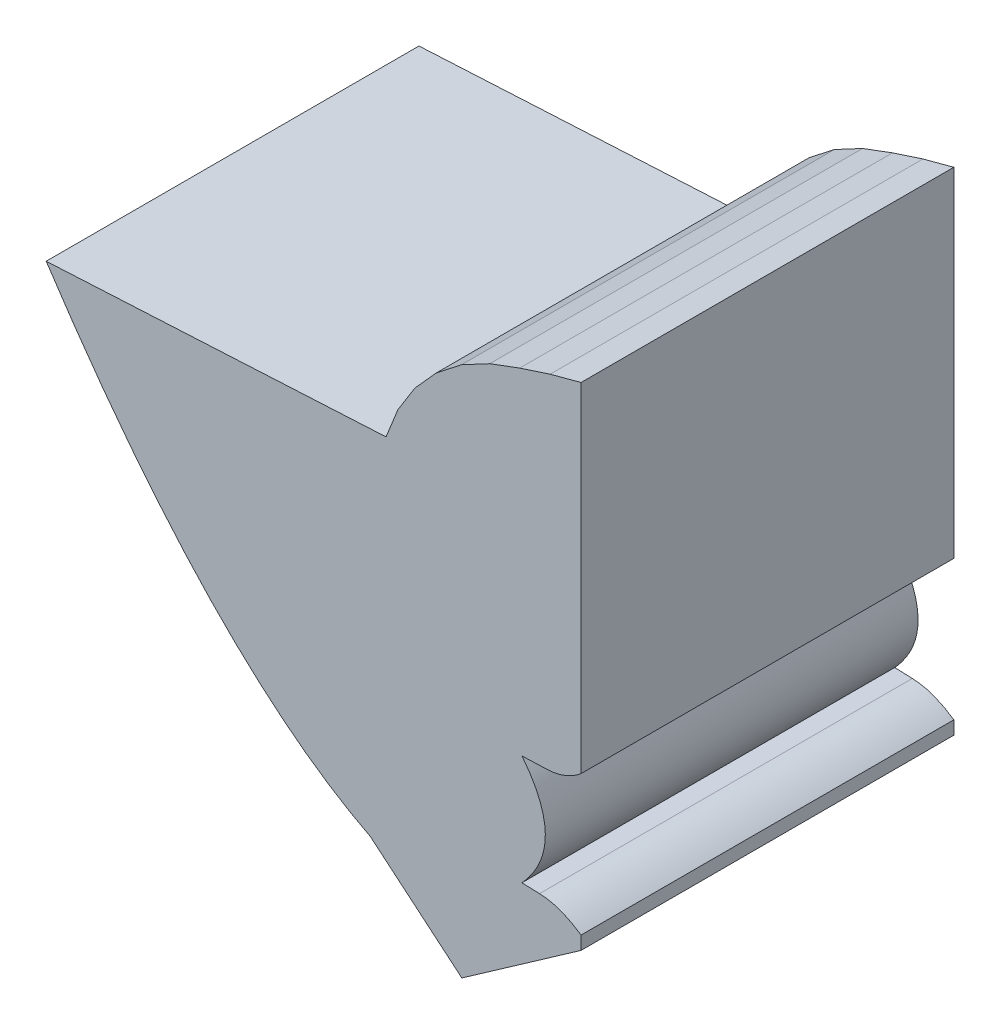
ISO-10303-21;
HEADER;
FILE_DESCRIPTION(('STEP AP214'),'2;1');
FILE_NAME('part.step','',(''),(''),'','','');
FILE_SCHEMA(('AUTOMOTIVE_DESIGN { 1 0 10303 214 1 1 1 1 }'));
ENDSEC;
DATA;
#1=APPLICATION_CONTEXT('core data for automotive mechanical design processes');
#2=APPLICATION_PROTOCOL_DEFINITION('international standard','automotive_design',2000,#1);
#3=PRODUCT_CONTEXT('',#1,'mechanical');
#4=PRODUCT('Part','Part','',(#3));
#5=PRODUCT_RELATED_PRODUCT_CATEGORY('part','',(#4));
#6=PRODUCT_DEFINITION_FORMATION('','',#4);
#7=PRODUCT_DEFINITION_CONTEXT('part definition',#1,'design');
#8=PRODUCT_DEFINITION('design','',#6,#7);
#9=PRODUCT_DEFINITION_SHAPE('','',#8);
#10=(LENGTH_UNIT() NAMED_UNIT(*) SI_UNIT(.MILLI.,.METRE.));
#11=(NAMED_UNIT(*) PLANE_ANGLE_UNIT() SI_UNIT($,.RADIAN.));
#12=(NAMED_UNIT(*) SI_UNIT($,.STERADIAN.) SOLID_ANGLE_UNIT());
#13=UNCERTAINTY_MEASURE_WITH_UNIT(LENGTH_MEASURE(1.E-05),#10,'distance_accuracy_value','');
#14=(GEOMETRIC_REPRESENTATION_CONTEXT(3) GLOBAL_UNCERTAINTY_ASSIGNED_CONTEXT((#13)) GLOBAL_UNIT_ASSIGNED_CONTEXT((#10,
#11,#12)) REPRESENTATION_CONTEXT('',''));
#15=CARTESIAN_POINT('',(0.,0.,0.));
#16=DIRECTION('',(0.,0.,1.));
#17=DIRECTION('',(1.,0.,0.));
#18=AXIS2_PLACEMENT_3D('',#15,#16,#17);
#19=CARTESIAN_POINT('',(-996004.99942647,89338.2959789018,30.7968303069805));
#20=CARTESIAN_POINT('',(996193.448091746,-87155.7427476542,30.7968303069805));
#21=CARTESIAN_POINT('',(-996386.896757022,84973.1895164066,30.7968303069805));
#22=B_SPLINE_CURVE_WITH_KNOTS('',2,(#19,#20,#21),.UNSPECIFIED.,.F.,.F.,(3,3),(0.,1.),.UNSPECIFIED.);
#23=DIRECTION('',(0.,0.,-1.));
#24=VECTOR('',#23,1.);
#25=SURFACE_OF_LINEAR_EXTRUSION('',#22,#24);
#26=CARTESIAN_POINT('',(-996004.99942647,89338.2959789018,6.9937));
#27=CARTESIAN_POINT('',(996193.448091746,-87155.7427476542,6.9937));
#28=CARTESIAN_POINT('',(-996386.896757022,84973.1895164066,6.9937));
#29=B_SPLINE_CURVE_WITH_KNOTS('',2,(#26,#27,#28),.UNSPECIFIED.,.F.,.F.,(3,3),(0.,1.),.UNSPECIFIED.);
#30=CARTESIAN_POINT('',(-2.11351559756429,2.34471545593529,6.9937));
#31=VERTEX_POINT('',#30);
#32=CARTESIAN_POINT('',(-2.11897326832718,-1.77801919490998,6.9937));
#33=VERTEX_POINT('',#32);
#34=EDGE_CURVE('E300',#31,#33,#29,.T.);
#35=ORIENTED_EDGE('',*,*,#34,.T.);
#36=DIRECTION('',(0.,0.,-1.));
#37=VECTOR('',#36,1.);
#38=CARTESIAN_POINT('',(-2.11897326731891,-1.77801919494525,0.));
#39=LINE('',#38,#37);
#40=CARTESIAN_POINT('',(-2.11897326832642,-1.77801919491,-6.9937));
#41=VERTEX_POINT('',#40);
#42=EDGE_CURVE('E224',#33,#41,#39,.T.);
#43=ORIENTED_EDGE('',*,*,#42,.T.);
#44=CARTESIAN_POINT('',(-996004.99942647,89338.2959789018,-6.9937));
#45=CARTESIAN_POINT('',(996193.448091746,-87155.7427476542,-6.9937));
#46=CARTESIAN_POINT('',(-996386.896757022,84973.1895164066,-6.9937));
#47=B_SPLINE_CURVE_WITH_KNOTS('',2,(#44,#45,#46),.UNSPECIFIED.,.F.,.F.,(3,3),(0.,1.),.UNSPECIFIED.);
#48=CARTESIAN_POINT('',(-2.11351559802885,2.3447154697661,-6.9937));
#49=VERTEX_POINT('',#48);
#50=EDGE_CURVE('E193',#41,#49,#47,.F.);
#51=ORIENTED_EDGE('',*,*,#50,.T.);
#52=DIRECTION('',(0.,0.,-1.));
#53=VECTOR('',#52,1.);
#54=CARTESIAN_POINT('',(-2.11351560820955,2.34471546941639,0.));
#55=LINE('',#54,#53);
#56=EDGE_CURVE('E63',#49,#31,#55,.F.);
#57=ORIENTED_EDGE('',*,*,#56,.T.);
#58=EDGE_LOOP('',(#35,#43,#51,#57));
#59=FACE_BOUND('',#58,.T.);
#60=ADVANCED_FACE('F60',(#59),#25,.T.);
#61=CARTESIAN_POINT('',(-82931.2998220372,996560.090302793,30.7968303069805));
#62=CARTESIAN_POINT('',(87153.689514863,-996199.076380996,30.7968303069805));
#63=CARTESIAN_POINT('',(-91384.2921388703,995820.549302198,30.7968303069805));
#64=B_SPLINE_CURVE_WITH_KNOTS('',2,(#61,#62,#63),.UNSPECIFIED.,.F.,.F.,(3,3),(0.,1.),.UNSPECIFIED.);
#65=DIRECTION('',(0.,0.,-1.));
#66=VECTOR('',#65,1.);
#67=SURFACE_OF_LINEAR_EXTRUSION('',#64,#66);
#68=CARTESIAN_POINT('',(-82931.2998220372,996560.090302793,-6.9937));
#69=CARTESIAN_POINT('',(87153.689514863,-996199.076380996,-6.9937));
#70=CARTESIAN_POINT('',(-91384.2921388703,995820.549302198,-6.9937));
#71=B_SPLINE_CURVE_WITH_KNOTS('',2,(#68,#69,#70),.UNSPECIFIED.,.F.,.F.,(3,3),(0.,1.),.UNSPECIFIED.);
#72=CARTESIAN_POINT('',(-19.9693590135837,9.49376503209609,-6.9937));
#73=VERTEX_POINT('',#72);
#74=CARTESIAN_POINT('',(-7.80629587003376,-3.11931996622238,-6.9937));
#75=VERTEX_POINT('',#74);
#76=EDGE_CURVE('E287',#73,#75,#71,.F.);
#77=ORIENTED_EDGE('',*,*,#76,.T.);
#78=DIRECTION('',(0.,0.,-1.));
#79=VECTOR('',#78,1.);
#80=CARTESIAN_POINT('',(-7.80629593446314,-3.11931991215808,0.));
#81=LINE('',#80,#79);
#82=CARTESIAN_POINT('',(-7.80629585753112,-3.11931995134695,6.9937));
#83=VERTEX_POINT('',#82);
#84=EDGE_CURVE('E13',#75,#83,#81,.F.);
#85=ORIENTED_EDGE('',*,*,#84,.T.);
#86=CARTESIAN_POINT('',(-82931.2998220372,996560.090302793,6.9937));
#87=CARTESIAN_POINT('',(87153.689514863,-996199.076380996,6.9937));
#88=CARTESIAN_POINT('',(-91384.2921388703,995820.549302198,6.9937));
#89=B_SPLINE_CURVE_WITH_KNOTS('',2,(#86,#87,#88),.UNSPECIFIED.,.F.,.F.,(3,3),(0.,1.),.UNSPECIFIED.);
#90=CARTESIAN_POINT('',(-19.9693590135837,9.49376503209609,6.9937));
#91=VERTEX_POINT('',#90);
#92=EDGE_CURVE('E296',#83,#91,#89,.T.);
#93=ORIENTED_EDGE('',*,*,#92,.T.);
#94=DIRECTION('',(0.,0.,1.));
#95=VECTOR('',#94,1.);
#96=CARTESIAN_POINT('',(-19.9693590135837,9.49376503209609,-6.9937));
#97=LINE('',#96,#95);
#98=EDGE_CURVE('E284',#73,#91,#97,.T.);
#99=ORIENTED_EDGE('',*,*,#98,.F.);
#100=EDGE_LOOP('',(#77,#85,#93,#99));
#101=FACE_BOUND('',#100,.T.);
#102=ADVANCED_FACE('F328',(#101),#67,.T.);
#103=CARTESIAN_POINT('',(0.,0.,6.9937));
#104=DIRECTION('',(0.,0.,1.));
#105=DIRECTION('',(1.,0.,0.));
#106=AXIS2_PLACEMENT_3D('',#103,#104,#105);
#107=PLANE('',#106);
#108=ORIENTED_EDGE('',*,*,#92,.F.);
#109=DIRECTION('',(0.766044443118984,-0.642787609686532,0.));
#110=VECTOR('',#109,1.);
#111=CARTESIAN_POINT('',(-9.72117641002242,-1.51254441136937,6.9937));
#112=LINE('',#111,#110);
#113=CARTESIAN_POINT('',(-4.37323509066481,-6.,6.9937));
#114=VERTEX_POINT('',#113);
#115=EDGE_CURVE('E75',#83,#114,#112,.T.);
#116=ORIENTED_EDGE('',*,*,#115,.T.);
#117=DIRECTION('',(0.819152044288989,0.57357643635105,0.));
#118=VECTOR('',#117,1.);
#119=CARTESIAN_POINT('',(0.100000000004221,-2.86780706932932,6.9937));
#120=LINE('',#119,#118);
#121=CARTESIAN_POINT('',(0.100000000004221,-2.86780706932932,6.9937));
#122=VERTEX_POINT('',#121);
#123=EDGE_CURVE('E225',#114,#122,#120,.T.);
#124=ORIENTED_EDGE('',*,*,#123,.T.);
#125=DIRECTION('',(8.61615466474804E-13,1.,0.));
#126=VECTOR('',#125,1.);
#127=CARTESIAN_POINT('',(0.100000000004652,-2.36780706932965,6.9937));
#128=LINE('',#127,#126);
#129=CARTESIAN_POINT('',(0.100000000004652,-2.36780706932965,6.9937));
#130=VERTEX_POINT('',#129);
#131=EDGE_CURVE('E235',#122,#130,#128,.T.);
#132=ORIENTED_EDGE('',*,*,#131,.T.);
#133=CARTESIAN_POINT('',(-15263.34989045,-999887.731463145,6.9937));
#134=CARTESIAN_POINT('',(17450.9064372768,999845.895156391,6.9937));
#135=CARTESIAN_POINT('',(-19644.4629841036,-999811.258849637,6.9937));
#136=B_SPLINE_CURVE_WITH_KNOTS('',2,(#133,#134,#135),.UNSPECIFIED.,.F.,.F.,(3,3),(0.,1.),.UNSPECIFIED.);
#137=CARTESIAN_POINT('',(-1.45812060541251,-1.80109667841963,6.9937));
#138=VERTEX_POINT('',#137);
#139=EDGE_CURVE('E226',#130,#138,#136,.T.);
#140=ORIENTED_EDGE('',*,*,#139,.T.);
#141=DIRECTION('',(-0.999390827019096,0.034899496702504,0.));
#142=VECTOR('',#141,1.);
#143=CARTESIAN_POINT('',(-1.45812060541251,-1.80109667841963,6.9937));
#144=LINE('',#143,#142);
#145=EDGE_CURVE('E201',#138,#33,#144,.T.);
#146=ORIENTED_EDGE('',*,*,#145,.T.);
#147=ORIENTED_EDGE('',*,*,#34,.F.);
#148=DIRECTION('',(0.999390827019096,0.0348994967025048,0.));
#149=VECTOR('',#148,1.);
#150=CARTESIAN_POINT('',(-2.17733041778456,2.34248700715526,6.9937));
#151=LINE('',#150,#149);
#152=CARTESIAN_POINT('',(-1.19050164048462,2.37694782742692,6.9937));
#153=VERTEX_POINT('',#152);
#154=EDGE_CURVE('E79',#31,#153,#151,.T.);
#155=ORIENTED_EDGE('',*,*,#154,.T.);
#156=CARTESIAN_POINT('',(-343900.072311573,939011.080499257,6.9937));
#157=CARTESIAN_POINT('',(342019.599581338,-939690.120785908,6.9937));
#158=CARTESIAN_POINT('',(-340141.301828429,940379.16107256,6.9937));
#159=B_SPLINE_CURVE_WITH_KNOTS('',2,(#156,#157,#158),.UNSPECIFIED.,.F.,.F.,(3,3),(0.,1.),.UNSPECIFIED.);
#160=CARTESIAN_POINT('',(0.100000000004221,2.87767341815847,6.9937));
#161=VERTEX_POINT('',#160);
#162=EDGE_CURVE('E278',#153,#161,#159,.T.);
#163=ORIENTED_EDGE('',*,*,#162,.T.);
#164=DIRECTION('',(0.,1.,0.));
#165=VECTOR('',#164,1.);
#166=CARTESIAN_POINT('',(0.100000000004221,2.87767341815847,6.9937));
#167=LINE('',#166,#165);
#168=CARTESIAN_POINT('',(0.100000000004747,15.587903347272,6.9937));
#169=VERTEX_POINT('',#168);
#170=EDGE_CURVE('E548',#161,#169,#167,.T.);
#171=ORIENTED_EDGE('',*,*,#170,.T.);
#172=DIRECTION('',(-0.96592582628907,-0.258819045102515,0.));
#173=VECTOR('',#172,1.);
#174=CARTESIAN_POINT('',(-1.05911099154214,15.277320493149,6.9937));
#175=LINE('',#174,#173);
#176=CARTESIAN_POINT('',(-1.05911099154214,15.277320493149,6.9937));
#177=VERTEX_POINT('',#176);
#178=EDGE_CURVE('E536',#169,#177,#175,.T.);
#179=ORIENTED_EDGE('',*,*,#178,.T.);
#180=DIRECTION('',(-0.951056516295155,-0.309016994374943,0.));
#181=VECTOR('',#180,1.);
#182=CARTESIAN_POINT('',(-2.20037881109632,14.906500099899,6.9937));
#183=LINE('',#182,#181);
#184=CARTESIAN_POINT('',(-2.20037881109632,14.906500099899,6.9937));
#185=VERTEX_POINT('',#184);
#186=EDGE_CURVE('E545',#177,#185,#183,.T.);
#187=ORIENTED_EDGE('',*,*,#186,.T.);
#188=DIRECTION('',(-0.9366721892484,-0.350207381259461,0.));
#189=VECTOR('',#188,1.);
#190=CARTESIAN_POINT('',(-3.3243854381944,14.4862512423877,6.9937));
#191=LINE('',#190,#189);
#192=CARTESIAN_POINT('',(-3.3243854381944,14.4862512423877,6.9937));
#193=VERTEX_POINT('',#192);
#194=EDGE_CURVE('E618',#185,#193,#191,.T.);
#195=ORIENTED_EDGE('',*,*,#194,.T.);
#196=DIRECTION('',(-0.882947592859007,-0.46947156278574,0.));
#197=VECTOR('',#196,1.);
#198=CARTESIAN_POINT('',(-4.38392254962521,13.9228853670448,6.9937));
#199=LINE('',#198,#197);
#200=CARTESIAN_POINT('',(-4.38392254962521,13.9228853670448,6.9937));
#201=VERTEX_POINT('',#200);
#202=EDGE_CURVE('E611',#193,#201,#199,.T.);
#203=ORIENTED_EDGE('',*,*,#202,.T.);
#204=DIRECTION('',(-0.788010753606726,-0.615661475325654,0.));
#205=VECTOR('',#204,1.);
#206=CARTESIAN_POINT('',(-5.32953545395328,13.184091596654,6.9937));
#207=LINE('',#206,#205);
#208=CARTESIAN_POINT('',(-5.32953545395328,13.184091596654,6.9937));
#209=VERTEX_POINT('',#208);
#210=EDGE_CURVE('E610',#201,#209,#207,.T.);
#211=ORIENTED_EDGE('',*,*,#210,.T.);
#212=DIRECTION('',(-0.669130606358526,-0.743144825477694,0.));
#213=VECTOR('',#212,1.);
#214=CARTESIAN_POINT('',(-6.13249218158351,12.2923178060808,6.9937));
#215=LINE('',#214,#213);
#216=CARTESIAN_POINT('',(-6.13249218158351,12.2923178060808,6.9937));
#217=VERTEX_POINT('',#216);
#218=EDGE_CURVE('E607',#209,#217,#215,.T.);
#219=ORIENTED_EDGE('',*,*,#218,.T.);
#220=DIRECTION('',(-0.52991926423321,-0.848048096156423,0.));
#221=VECTOR('',#220,1.);
#222=CARTESIAN_POINT('',(-6.76839529866336,11.2746600906931,6.9937));
#223=LINE('',#222,#221);
#224=CARTESIAN_POINT('',(-6.76839529866336,11.2746600906931,6.9937));
#225=VERTEX_POINT('',#224);
#226=EDGE_CURVE('E601',#217,#225,#223,.T.);
#227=ORIENTED_EDGE('',*,*,#226,.T.);
#228=DIRECTION('',(-0.374606593415918,-0.927183854566785,0.));
#229=VECTOR('',#228,1.);
#230=CARTESIAN_POINT('',(-7.21792321076246,10.1620394652129,6.9937));
#231=LINE('',#230,#229);
#232=CARTESIAN_POINT('',(-7.21792321076246,10.1620394652129,6.9937));
#233=VERTEX_POINT('',#232);
#234=EDGE_CURVE('E604',#225,#233,#231,.T.);
#235=ORIENTED_EDGE('',*,*,#234,.T.);
#236=DIRECTION('',(-0.998629534754487,-0.0523359562445909,0.));
#237=VECTOR('',#236,1.);
#238=CARTESIAN_POINT('',(-19.9693590135837,9.49376503209609,6.9937));
#239=LINE('',#238,#237);
#240=EDGE_CURVE('E271',#233,#91,#239,.T.);
#241=ORIENTED_EDGE('',*,*,#240,.T.);
#242=EDGE_LOOP('',(#108,#116,#124,#132,#140,#146,#147,#155,#163,#171,#179,#187,#195,#203,#211,
#219,#227,#235,#241));
#243=FACE_BOUND('',#242,.T.);
#244=ADVANCED_FACE('F327',(#243),#107,.T.);
#245=CARTESIAN_POINT('',(0.,0.,-6.9937));
#246=DIRECTION('',(0.,0.,1.));
#247=DIRECTION('',(1.,0.,0.));
#248=AXIS2_PLACEMENT_3D('',#245,#246,#247);
#249=PLANE('',#248);
#250=ORIENTED_EDGE('',*,*,#50,.F.);
#251=DIRECTION('',(0.999390827019096,-0.034899496702504,0.));
#252=VECTOR('',#251,1.);
#253=CARTESIAN_POINT('',(-1.45812060541251,-1.80109667841963,-6.9937));
#254=LINE('',#253,#252);
#255=CARTESIAN_POINT('',(-1.45812060541251,-1.80109667841963,-6.9937));
#256=VERTEX_POINT('',#255);
#257=EDGE_CURVE('E189',#41,#256,#254,.T.);
#258=ORIENTED_EDGE('',*,*,#257,.T.);
#259=CARTESIAN_POINT('',(-15263.34989045,-999887.731463145,-6.9937));
#260=CARTESIAN_POINT('',(17450.9064372768,999845.895156391,-6.9937));
#261=CARTESIAN_POINT('',(-19644.4629841036,-999811.258849637,-6.9937));
#262=B_SPLINE_CURVE_WITH_KNOTS('',2,(#259,#260,#261),.UNSPECIFIED.,.F.,.F.,(3,3),(0.,1.),.UNSPECIFIED.);
#263=CARTESIAN_POINT('',(0.100000000004652,-2.36780706932965,-6.9937));
#264=VERTEX_POINT('',#263);
#265=EDGE_CURVE('E194',#256,#264,#262,.F.);
#266=ORIENTED_EDGE('',*,*,#265,.T.);
#267=DIRECTION('',(-8.61615466474804E-13,-1.,0.));
#268=VECTOR('',#267,1.);
#269=CARTESIAN_POINT('',(0.100000000004652,-2.36780706932965,-6.9937));
#270=LINE('',#269,#268);
#271=CARTESIAN_POINT('',(0.100000000004221,-2.86780706932932,-6.9937));
#272=VERTEX_POINT('',#271);
#273=EDGE_CURVE('E212',#264,#272,#270,.T.);
#274=ORIENTED_EDGE('',*,*,#273,.T.);
#275=DIRECTION('',(-0.819152044288989,-0.57357643635105,0.));
#276=VECTOR('',#275,1.);
#277=CARTESIAN_POINT('',(0.100000000004221,-2.86780706932932,-6.9937));
#278=LINE('',#277,#276);
#279=CARTESIAN_POINT('',(-4.37323509066481,-6.,-6.9937));
#280=VERTEX_POINT('',#279);
#281=EDGE_CURVE('E215',#272,#280,#278,.T.);
#282=ORIENTED_EDGE('',*,*,#281,.T.);
#283=DIRECTION('',(-0.766044443118984,0.642787609686532,0.));
#284=VECTOR('',#283,1.);
#285=CARTESIAN_POINT('',(-9.72117641002242,-1.51254441136937,-6.9937));
#286=LINE('',#285,#284);
#287=EDGE_CURVE('E357',#280,#75,#286,.T.);
#288=ORIENTED_EDGE('',*,*,#287,.T.);
#289=ORIENTED_EDGE('',*,*,#76,.F.);
#290=DIRECTION('',(-0.998629534754487,-0.0523359562445909,0.));
#291=VECTOR('',#290,1.);
#292=CARTESIAN_POINT('',(-19.9693590135837,9.49376503209609,-6.9937));
#293=LINE('',#292,#291);
#294=CARTESIAN_POINT('',(-7.21792321076246,10.1620394652129,-6.9937));
#295=VERTEX_POINT('',#294);
#296=EDGE_CURVE('E276',#295,#73,#293,.T.);
#297=ORIENTED_EDGE('',*,*,#296,.F.);
#298=DIRECTION('',(0.374606593415918,0.927183854566785,0.));
#299=VECTOR('',#298,1.);
#300=CARTESIAN_POINT('',(-7.21792321076246,10.1620394652129,-6.9937));
#301=LINE('',#300,#299);
#302=CARTESIAN_POINT('',(-6.76839529866336,11.2746600906931,-6.9937));
#303=VERTEX_POINT('',#302);
#304=EDGE_CURVE('E355',#295,#303,#301,.T.);
#305=ORIENTED_EDGE('',*,*,#304,.T.);
#306=DIRECTION('',(0.52991926423321,0.848048096156423,0.));
#307=VECTOR('',#306,1.);
#308=CARTESIAN_POINT('',(-6.76839529866336,11.2746600906931,-6.9937));
#309=LINE('',#308,#307);
#310=CARTESIAN_POINT('',(-6.13249218158351,12.2923178060808,-6.9937));
#311=VERTEX_POINT('',#310);
#312=EDGE_CURVE('E578',#303,#311,#309,.T.);
#313=ORIENTED_EDGE('',*,*,#312,.T.);
#314=DIRECTION('',(0.669130606358526,0.743144825477694,0.));
#315=VECTOR('',#314,1.);
#316=CARTESIAN_POINT('',(-6.13249218158351,12.2923178060808,-6.9937));
#317=LINE('',#316,#315);
#318=CARTESIAN_POINT('',(-5.32953545395328,13.184091596654,-6.9937));
#319=VERTEX_POINT('',#318);
#320=EDGE_CURVE('E635',#311,#319,#317,.T.);
#321=ORIENTED_EDGE('',*,*,#320,.T.);
#322=DIRECTION('',(0.788010753606726,0.615661475325654,0.));
#323=VECTOR('',#322,1.);
#324=CARTESIAN_POINT('',(-5.32953545395328,13.184091596654,-6.9937));
#325=LINE('',#324,#323);
#326=CARTESIAN_POINT('',(-4.38392254962521,13.9228853670448,-6.9937));
#327=VERTEX_POINT('',#326);
#328=EDGE_CURVE('E628',#319,#327,#325,.T.);
#329=ORIENTED_EDGE('',*,*,#328,.T.);
#330=DIRECTION('',(0.882947592859007,0.46947156278574,0.));
#331=VECTOR('',#330,1.);
#332=CARTESIAN_POINT('',(-4.38392254962521,13.9228853670448,-6.9937));
#333=LINE('',#332,#331);
#334=CARTESIAN_POINT('',(-3.3243854381944,14.4862512423877,-6.9937));
#335=VERTEX_POINT('',#334);
#336=EDGE_CURVE('E630',#327,#335,#333,.T.);
#337=ORIENTED_EDGE('',*,*,#336,.T.);
#338=DIRECTION('',(0.9366721892484,0.350207381259461,0.));
#339=VECTOR('',#338,1.);
#340=CARTESIAN_POINT('',(-3.3243854381944,14.4862512423877,-6.9937));
#341=LINE('',#340,#339);
#342=CARTESIAN_POINT('',(-2.20037881109632,14.906500099899,-6.9937));
#343=VERTEX_POINT('',#342);
#344=EDGE_CURVE('E621',#335,#343,#341,.T.);
#345=ORIENTED_EDGE('',*,*,#344,.T.);
#346=DIRECTION('',(0.951056516295155,0.309016994374943,0.));
#347=VECTOR('',#346,1.);
#348=CARTESIAN_POINT('',(-2.20037881109632,14.906500099899,-6.9937));
#349=LINE('',#348,#347);
#350=CARTESIAN_POINT('',(-1.05911099154214,15.277320493149,-6.9937));
#351=VERTEX_POINT('',#350);
#352=EDGE_CURVE('E595',#343,#351,#349,.T.);
#353=ORIENTED_EDGE('',*,*,#352,.T.);
#354=DIRECTION('',(0.96592582628907,0.258819045102515,0.));
#355=VECTOR('',#354,1.);
#356=CARTESIAN_POINT('',(-1.05911099154214,15.277320493149,-6.9937));
#357=LINE('',#356,#355);
#358=CARTESIAN_POINT('',(0.100000000004747,15.587903347272,-6.9937));
#359=VERTEX_POINT('',#358);
#360=EDGE_CURVE('E587',#351,#359,#357,.T.);
#361=ORIENTED_EDGE('',*,*,#360,.T.);
#362=DIRECTION('',(0.,-1.,0.));
#363=VECTOR('',#362,1.);
#364=CARTESIAN_POINT('',(0.100000000004221,2.87767341815847,-6.9937));
#365=LINE('',#364,#363);
#366=CARTESIAN_POINT('',(0.0999999999995449,2.8776734181557,-6.9937));
#367=VERTEX_POINT('',#366);
#368=EDGE_CURVE('E580',#359,#367,#365,.T.);
#369=ORIENTED_EDGE('',*,*,#368,.T.);
#370=CARTESIAN_POINT('',(-343900.072311573,939011.080499257,-6.9937));
#371=CARTESIAN_POINT('',(342019.599581338,-939690.120785908,-6.9937));
#372=CARTESIAN_POINT('',(-340141.301828429,940379.16107256,-6.9937));
#373=B_SPLINE_CURVE_WITH_KNOTS('',2,(#370,#371,#372),.UNSPECIFIED.,.F.,.F.,(3,3),(0.,1.),.UNSPECIFIED.);
#374=CARTESIAN_POINT('',(-1.19050164048462,2.37694782741517,-6.9937));
#375=VERTEX_POINT('',#374);
#376=EDGE_CURVE('E575',#367,#375,#373,.F.);
#377=ORIENTED_EDGE('',*,*,#376,.T.);
#378=DIRECTION('',(-0.999390827019096,-0.0348994967025048,0.));
#379=VECTOR('',#378,1.);
#380=CARTESIAN_POINT('',(-2.17733041778456,2.34248700715526,-6.9937));
#381=LINE('',#380,#379);
#382=EDGE_CURVE('E574',#375,#49,#381,.T.);
#383=ORIENTED_EDGE('',*,*,#382,.T.);
#384=EDGE_LOOP('',(#250,#258,#266,#274,#282,#288,#289,#297,#305,#313,#321,#329,#337,#345,#353,
#361,#369,#377,#383));
#385=FACE_BOUND('',#384,.T.);
#386=ADVANCED_FACE('F56',(#385),#249,.F.);
#387=CARTESIAN_POINT('',(-19.9693590135837,9.49376503209609,-6.9937));
#388=DIRECTION('',(-0.0523359562445909,0.998629534754487,0.));
#389=DIRECTION('',(-0.998629534754488,-0.052335956244591,0.));
#390=AXIS2_PLACEMENT_3D('',#387,#388,#389);
#391=PLANE('',#390);
#392=ORIENTED_EDGE('',*,*,#240,.F.);
#393=DIRECTION('',(0.,0.,-1.));
#394=VECTOR('',#393,1.);
#395=CARTESIAN_POINT('',(-7.21792321076246,10.1620394652129,23.8402253000013));
#396=LINE('',#395,#394);
#397=EDGE_CURVE('E349',#233,#295,#396,.T.);
#398=ORIENTED_EDGE('',*,*,#397,.T.);
#399=ORIENTED_EDGE('',*,*,#296,.T.);
#400=ORIENTED_EDGE('',*,*,#98,.T.);
#401=EDGE_LOOP('',(#392,#398,#399,#400));
#402=FACE_BOUND('',#401,.T.);
#403=ADVANCED_FACE('F335',(#402),#391,.T.);
#404=CARTESIAN_POINT('',(-1.05911099154214,15.277320493149,23.8402253000013));
#405=DIRECTION('',(0.258819045102515,-0.96592582628907,0.));
#406=DIRECTION('',(0.96592582628907,0.258819045102515,0.));
#407=AXIS2_PLACEMENT_3D('',#404,#405,#406);
#408=PLANE('',#407);
#409=ORIENTED_EDGE('',*,*,#178,.F.);
#410=DIRECTION('',(0.,0.,-1.));
#411=VECTOR('',#410,1.);
#412=CARTESIAN_POINT('',(0.100000000004747,15.587903347272,23.8402253000013));
#413=LINE('',#412,#411);
#414=EDGE_CURVE('E272',#169,#359,#413,.T.);
#415=ORIENTED_EDGE('',*,*,#414,.T.);
#416=ORIENTED_EDGE('',*,*,#360,.F.);
#417=DIRECTION('',(0.,0.,-1.));
#418=VECTOR('',#417,1.);
#419=CARTESIAN_POINT('',(-1.05911099154214,15.277320493149,23.8402253000013));
#420=LINE('',#419,#418);
#421=EDGE_CURVE('E544',#177,#351,#420,.T.);
#422=ORIENTED_EDGE('',*,*,#421,.F.);
#423=EDGE_LOOP('',(#409,#415,#416,#422));
#424=FACE_BOUND('',#423,.T.);
#425=ADVANCED_FACE('F495',(#424),#408,.F.);
#426=CARTESIAN_POINT('',(-2.20037881109632,14.906500099899,23.8402253000013));
#427=DIRECTION('',(0.309016994374943,-0.951056516295155,0.));
#428=DIRECTION('',(0.951056516295155,0.309016994374943,0.));
#429=AXIS2_PLACEMENT_3D('',#426,#427,#428);
#430=PLANE('',#429);
#431=ORIENTED_EDGE('',*,*,#186,.F.);
#432=ORIENTED_EDGE('',*,*,#421,.T.);
#433=ORIENTED_EDGE('',*,*,#352,.F.);
#434=DIRECTION('',(0.,0.,-1.));
#435=VECTOR('',#434,1.);
#436=CARTESIAN_POINT('',(-2.20037881109632,14.906500099899,23.8402253000013));
#437=LINE('',#436,#435);
#438=EDGE_CURVE('E560',#185,#343,#437,.T.);
#439=ORIENTED_EDGE('',*,*,#438,.F.);
#440=EDGE_LOOP('',(#431,#432,#433,#439));
#441=FACE_BOUND('',#440,.T.);
#442=ADVANCED_FACE('F481',(#441),#430,.F.);
#443=CARTESIAN_POINT('',(-3.3243854381944,14.4862512423877,23.8402253000013));
#444=DIRECTION('',(0.350207381259461,-0.9366721892484,0.));
#445=DIRECTION('',(0.9366721892484,0.350207381259461,0.));
#446=AXIS2_PLACEMENT_3D('',#443,#444,#445);
#447=PLANE('',#446);
#448=ORIENTED_EDGE('',*,*,#194,.F.);
#449=ORIENTED_EDGE('',*,*,#438,.T.);
#450=ORIENTED_EDGE('',*,*,#344,.F.);
#451=DIRECTION('',(0.,0.,-1.));
#452=VECTOR('',#451,1.);
#453=CARTESIAN_POINT('',(-3.3243854381944,14.4862512423877,23.8402253000013));
#454=LINE('',#453,#452);
#455=EDGE_CURVE('E559',#193,#335,#454,.T.);
#456=ORIENTED_EDGE('',*,*,#455,.F.);
#457=EDGE_LOOP('',(#448,#449,#450,#456));
#458=FACE_BOUND('',#457,.T.);
#459=ADVANCED_FACE('F471',(#458),#447,.F.);
#460=CARTESIAN_POINT('',(-4.38392254962521,13.9228853670448,23.8402253000013));
#461=DIRECTION('',(0.46947156278574,-0.882947592859007,0.));
#462=DIRECTION('',(0.882947592859007,0.46947156278574,0.));
#463=AXIS2_PLACEMENT_3D('',#460,#461,#462);
#464=PLANE('',#463);
#465=ORIENTED_EDGE('',*,*,#202,.F.);
#466=ORIENTED_EDGE('',*,*,#455,.T.);
#467=ORIENTED_EDGE('',*,*,#336,.F.);
#468=DIRECTION('',(0.,0.,-1.));
#469=VECTOR('',#468,1.);
#470=CARTESIAN_POINT('',(-4.38392254962521,13.9228853670448,23.8402253000013));
#471=LINE('',#470,#469);
#472=EDGE_CURVE('E561',#201,#327,#471,.T.);
#473=ORIENTED_EDGE('',*,*,#472,.F.);
#474=EDGE_LOOP('',(#465,#466,#467,#473));
#475=FACE_BOUND('',#474,.T.);
#476=ADVANCED_FACE('F463',(#475),#464,.F.);
#477=CARTESIAN_POINT('',(-5.32953545395328,13.184091596654,23.8402253000013));
#478=DIRECTION('',(0.615661475325654,-0.788010753606726,0.));
#479=DIRECTION('',(0.788010753606726,0.615661475325654,0.));
#480=AXIS2_PLACEMENT_3D('',#477,#478,#479);
#481=PLANE('',#480);
#482=ORIENTED_EDGE('',*,*,#210,.F.);
#483=ORIENTED_EDGE('',*,*,#472,.T.);
#484=ORIENTED_EDGE('',*,*,#328,.F.);
#485=DIRECTION('',(0.,0.,-1.));
#486=VECTOR('',#485,1.);
#487=CARTESIAN_POINT('',(-5.32953545395328,13.184091596654,23.8402253000013));
#488=LINE('',#487,#486);
#489=EDGE_CURVE('E563',#209,#319,#488,.T.);
#490=ORIENTED_EDGE('',*,*,#489,.F.);
#491=EDGE_LOOP('',(#482,#483,#484,#490));
#492=FACE_BOUND('',#491,.T.);
#493=ADVANCED_FACE('F458',(#492),#481,.F.);
#494=CARTESIAN_POINT('',(-6.13249218158351,12.2923178060808,23.8402253000013));
#495=DIRECTION('',(0.743144825477694,-0.669130606358526,0.));
#496=DIRECTION('',(0.669130606358526,0.743144825477694,0.));
#497=AXIS2_PLACEMENT_3D('',#494,#495,#496);
#498=PLANE('',#497);
#499=ORIENTED_EDGE('',*,*,#218,.F.);
#500=ORIENTED_EDGE('',*,*,#489,.T.);
#501=ORIENTED_EDGE('',*,*,#320,.F.);
#502=DIRECTION('',(0.,0.,-1.));
#503=VECTOR('',#502,1.);
#504=CARTESIAN_POINT('',(-6.13249218158351,12.2923178060808,23.8402253000013));
#505=LINE('',#504,#503);
#506=EDGE_CURVE('E564',#217,#311,#505,.T.);
#507=ORIENTED_EDGE('',*,*,#506,.F.);
#508=EDGE_LOOP('',(#499,#500,#501,#507));
#509=FACE_BOUND('',#508,.T.);
#510=ADVANCED_FACE('F450',(#509),#498,.F.);
#511=CARTESIAN_POINT('',(-6.76839529866336,11.2746600906931,23.8402253000013));
#512=DIRECTION('',(0.848048096156423,-0.529919264233209,0.));
#513=DIRECTION('',(0.52991926423321,0.848048096156423,0.));
#514=AXIS2_PLACEMENT_3D('',#511,#512,#513);
#515=PLANE('',#514);
#516=ORIENTED_EDGE('',*,*,#226,.F.);
#517=ORIENTED_EDGE('',*,*,#506,.T.);
#518=ORIENTED_EDGE('',*,*,#312,.F.);
#519=DIRECTION('',(0.,0.,-1.));
#520=VECTOR('',#519,1.);
#521=CARTESIAN_POINT('',(-6.76839529866336,11.2746600906931,23.8402253000013));
#522=LINE('',#521,#520);
#523=EDGE_CURVE('E570',#225,#303,#522,.T.);
#524=ORIENTED_EDGE('',*,*,#523,.F.);
#525=EDGE_LOOP('',(#516,#517,#518,#524));
#526=FACE_BOUND('',#525,.T.);
#527=ADVANCED_FACE('F437',(#526),#515,.F.);
#528=CARTESIAN_POINT('',(-7.21792321076246,10.1620394652129,23.8402253000013));
#529=DIRECTION('',(0.927183854566785,-0.374606593415918,0.));
#530=DIRECTION('',(0.374606593415918,0.927183854566785,0.));
#531=AXIS2_PLACEMENT_3D('',#528,#529,#530);
#532=PLANE('',#531);
#533=ORIENTED_EDGE('',*,*,#234,.F.);
#534=ORIENTED_EDGE('',*,*,#523,.T.);
#535=ORIENTED_EDGE('',*,*,#304,.F.);
#536=ORIENTED_EDGE('',*,*,#397,.F.);
#537=EDGE_LOOP('',(#533,#534,#535,#536));
#538=FACE_BOUND('',#537,.T.);
#539=ADVANCED_FACE('F435',(#538),#532,.F.);
#540=CARTESIAN_POINT('',(-2.17733041778456,2.34248700715526,23.8402253000013));
#541=DIRECTION('',(-0.0348994967025048,0.999390827019096,0.));
#542=DIRECTION('',(-0.999390827019096,-0.0348994967025048,0.));
#543=AXIS2_PLACEMENT_3D('',#540,#541,#542);
#544=PLANE('',#543);
#545=ORIENTED_EDGE('',*,*,#56,.F.);
#546=ORIENTED_EDGE('',*,*,#382,.F.);
#547=DIRECTION('',(0.,0.,-1.));
#548=VECTOR('',#547,1.);
#549=CARTESIAN_POINT('',(-1.19050164048462,2.37694782742692,23.8402253000013));
#550=LINE('',#549,#548);
#551=EDGE_CURVE('E551',#153,#375,#550,.T.);
#552=ORIENTED_EDGE('',*,*,#551,.F.);
#553=ORIENTED_EDGE('',*,*,#154,.F.);
#554=EDGE_LOOP('',(#545,#546,#552,#553));
#555=FACE_BOUND('',#554,.T.);
#556=ADVANCED_FACE('F261',(#555),#544,.F.);
#557=CARTESIAN_POINT('',(-343900.072311573,939011.080499257,23.8402253000013));
#558=CARTESIAN_POINT('',(342019.599581338,-939690.120785908,23.8402253000013));
#559=CARTESIAN_POINT('',(-340141.301828429,940379.16107256,23.8402253000013));
#560=B_SPLINE_CURVE_WITH_KNOTS('',2,(#557,#558,#559),.UNSPECIFIED.,.F.,.F.,(3,3),(0.,1.),.UNSPECIFIED.);
#561=DIRECTION('',(0.,0.,-1.));
#562=VECTOR('',#561,1.);
#563=SURFACE_OF_LINEAR_EXTRUSION('',#560,#562);
#564=ORIENTED_EDGE('',*,*,#162,.F.);
#565=ORIENTED_EDGE('',*,*,#551,.T.);
#566=ORIENTED_EDGE('',*,*,#376,.F.);
#567=DIRECTION('',(0.,0.,-1.));
#568=VECTOR('',#567,1.);
#569=CARTESIAN_POINT('',(0.100000000004221,2.87767341815847,23.8402253000013));
#570=LINE('',#569,#568);
#571=EDGE_CURVE('E553',#161,#367,#570,.T.);
#572=ORIENTED_EDGE('',*,*,#571,.F.);
#573=EDGE_LOOP('',(#564,#565,#566,#572));
#574=FACE_BOUND('',#573,.T.);
#575=ADVANCED_FACE('F260',(#574),#563,.F.);
#576=CARTESIAN_POINT('',(0.100000000004221,2.87767341815847,23.8402253000013));
#577=DIRECTION('',(-1.,0.,0.));
#578=DIRECTION('',(0.,-1.,0.));
#579=AXIS2_PLACEMENT_3D('',#576,#577,#578);
#580=PLANE('',#579);
#581=ORIENTED_EDGE('',*,*,#170,.F.);
#582=ORIENTED_EDGE('',*,*,#571,.T.);
#583=ORIENTED_EDGE('',*,*,#368,.F.);
#584=ORIENTED_EDGE('',*,*,#414,.F.);
#585=EDGE_LOOP('',(#581,#582,#583,#584));
#586=FACE_BOUND('',#585,.T.);
#587=ADVANCED_FACE('F251',(#586),#580,.F.);
#588=CARTESIAN_POINT('',(-15263.34989045,-999887.731463145,17.7915129145181));
#589=CARTESIAN_POINT('',(17450.9064372768,999845.895156391,17.7915129145181));
#590=CARTESIAN_POINT('',(-19644.4629841036,-999811.258849637,17.7915129145181));
#591=B_SPLINE_CURVE_WITH_KNOTS('',2,(#588,#589,#590),.UNSPECIFIED.,.F.,.F.,(3,3),(0.,1.),.UNSPECIFIED.);
#592=DIRECTION('',(0.,0.,-1.));
#593=VECTOR('',#592,1.);
#594=SURFACE_OF_LINEAR_EXTRUSION('',#591,#593);
#595=ORIENTED_EDGE('',*,*,#139,.F.);
#596=DIRECTION('',(0.,0.,-1.));
#597=VECTOR('',#596,1.);
#598=CARTESIAN_POINT('',(0.100000000004652,-2.36780706932965,17.7915129145181));
#599=LINE('',#598,#597);
#600=EDGE_CURVE('E196',#130,#264,#599,.T.);
#601=ORIENTED_EDGE('',*,*,#600,.T.);
#602=ORIENTED_EDGE('',*,*,#265,.F.);
#603=DIRECTION('',(0.,0.,-1.));
#604=VECTOR('',#603,1.);
#605=CARTESIAN_POINT('',(-1.45812060541251,-1.80109667841963,17.7915129145181));
#606=LINE('',#605,#604);
#607=EDGE_CURVE('E202',#138,#256,#606,.T.);
#608=ORIENTED_EDGE('',*,*,#607,.F.);
#609=EDGE_LOOP('',(#595,#601,#602,#608));
#610=FACE_BOUND('',#609,.T.);
#611=ADVANCED_FACE('F208',(#610),#594,.F.);
#612=CARTESIAN_POINT('',(-1.45812060541251,-1.80109667841963,17.7915129145181));
#613=DIRECTION('',(-0.034899496702504,-0.999390827019096,0.));
#614=DIRECTION('',(0.999390827019096,-0.034899496702504,0.));
#615=AXIS2_PLACEMENT_3D('',#612,#613,#614);
#616=PLANE('',#615);
#617=ORIENTED_EDGE('',*,*,#42,.F.);
#618=ORIENTED_EDGE('',*,*,#145,.F.);
#619=ORIENTED_EDGE('',*,*,#607,.T.);
#620=ORIENTED_EDGE('',*,*,#257,.F.);
#621=EDGE_LOOP('',(#617,#618,#619,#620));
#622=FACE_BOUND('',#621,.T.);
#623=ADVANCED_FACE('F205',(#622),#616,.F.);
#624=CARTESIAN_POINT('',(-9.72117641002242,-1.51254441136937,17.7915129145181));
#625=DIRECTION('',(0.642787609686533,0.766044443118984,0.));
#626=DIRECTION('',(-0.766044443118984,0.642787609686532,0.));
#627=AXIS2_PLACEMENT_3D('',#624,#625,#626);
#628=PLANE('',#627);
#629=ORIENTED_EDGE('',*,*,#84,.F.);
#630=ORIENTED_EDGE('',*,*,#287,.F.);
#631=DIRECTION('',(0.,0.,-1.));
#632=VECTOR('',#631,1.);
#633=CARTESIAN_POINT('',(-4.37323509066481,-6.,17.7915129145181));
#634=LINE('',#633,#632);
#635=EDGE_CURVE('E206',#114,#280,#634,.T.);
#636=ORIENTED_EDGE('',*,*,#635,.F.);
#637=ORIENTED_EDGE('',*,*,#115,.F.);
#638=EDGE_LOOP('',(#629,#630,#636,#637));
#639=FACE_BOUND('',#638,.T.);
#640=ADVANCED_FACE('F359',(#639),#628,.F.);
#641=CARTESIAN_POINT('',(0.100000000004221,-2.86780706932932,17.7915129145181));
#642=DIRECTION('',(-0.57357643635105,0.819152044288989,0.));
#643=DIRECTION('',(-0.819152044288989,-0.57357643635105,0.));
#644=AXIS2_PLACEMENT_3D('',#641,#642,#643);
#645=PLANE('',#644);
#646=ORIENTED_EDGE('',*,*,#123,.F.);
#647=ORIENTED_EDGE('',*,*,#635,.T.);
#648=ORIENTED_EDGE('',*,*,#281,.F.);
#649=DIRECTION('',(0.,0.,-1.));
#650=VECTOR('',#649,1.);
#651=CARTESIAN_POINT('',(0.100000000004221,-2.86780706932932,17.7915129145181));
#652=LINE('',#651,#650);
#653=EDGE_CURVE('E240',#122,#272,#652,.T.);
#654=ORIENTED_EDGE('',*,*,#653,.F.);
#655=EDGE_LOOP('',(#646,#647,#648,#654));
#656=FACE_BOUND('',#655,.T.);
#657=ADVANCED_FACE('F365',(#656),#645,.F.);
#658=CARTESIAN_POINT('',(0.100000000004652,-2.36780706932965,17.7915129145181));
#659=DIRECTION('',(-1.,8.61615466474804E-13,0.));
#660=DIRECTION('',(-8.61615466474804E-13,-1.,0.));
#661=AXIS2_PLACEMENT_3D('',#658,#659,#660);
#662=PLANE('',#661);
#663=ORIENTED_EDGE('',*,*,#131,.F.);
#664=ORIENTED_EDGE('',*,*,#653,.T.);
#665=ORIENTED_EDGE('',*,*,#273,.F.);
#666=ORIENTED_EDGE('',*,*,#600,.F.);
#667=EDGE_LOOP('',(#663,#664,#665,#666));
#668=FACE_BOUND('',#667,.T.);
#669=ADVANCED_FACE('F362',(#668),#662,.F.);
#670=CLOSED_SHELL('',(#60,#102,#244,#386,#403,#425,#442,#459,#476,#493,#510,#527,#539,#556,#575,
#587,#611,#623,#640,#657,#669));
#671=MANIFOLD_SOLID_BREP('B2',#670);
#672=ADVANCED_BREP_SHAPE_REPRESENTATION('',(#18,#671),#14);
#673=SHAPE_DEFINITION_REPRESENTATION(#9,#672);
ENDSEC;
END-ISO-10303-21;
